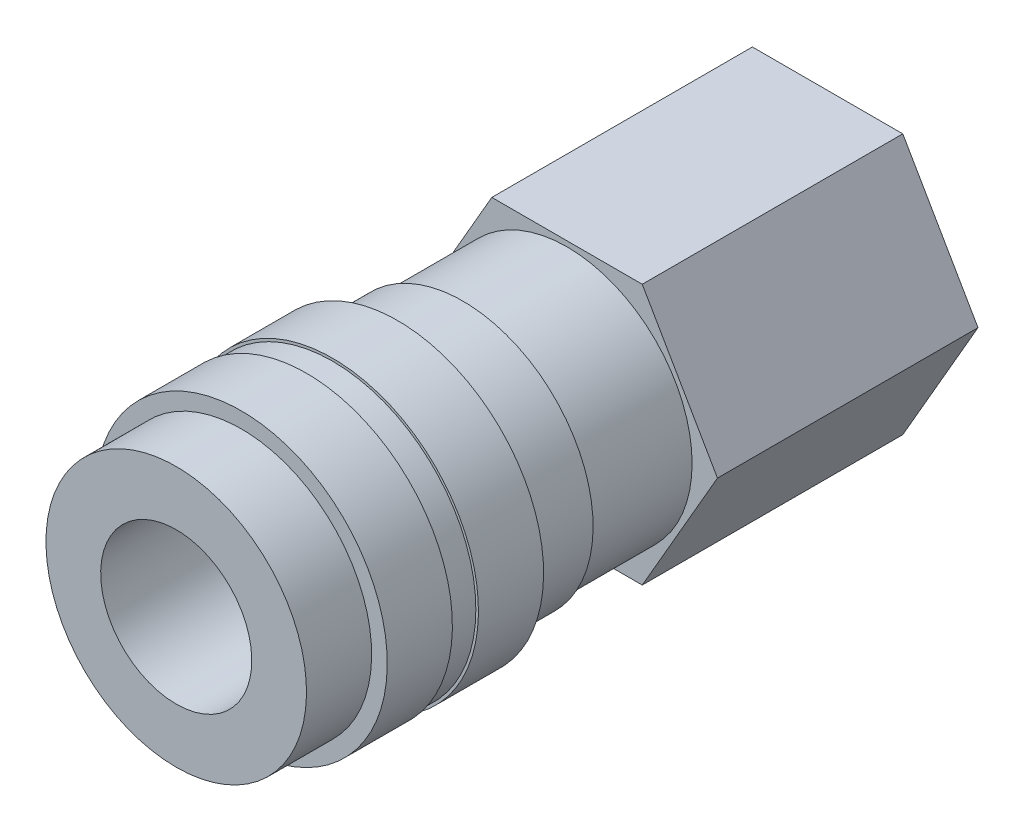
ISO-10303-21;
HEADER;
FILE_DESCRIPTION(('STEP AP214'),'2;1');
FILE_NAME('part.step','',(''),(''),'','','');
FILE_SCHEMA(('AUTOMOTIVE_DESIGN { 1 0 10303 214 1 1 1 1 }'));
ENDSEC;
DATA;
#1=APPLICATION_CONTEXT('core data for automotive mechanical design processes');
#2=APPLICATION_PROTOCOL_DEFINITION('international standard','automotive_design',2000,#1);
#3=PRODUCT_CONTEXT('',#1,'mechanical');
#4=PRODUCT('Part','Part','',(#3));
#5=PRODUCT_RELATED_PRODUCT_CATEGORY('part','',(#4));
#6=PRODUCT_DEFINITION_FORMATION('','',#4);
#7=PRODUCT_DEFINITION_CONTEXT('part definition',#1,'design');
#8=PRODUCT_DEFINITION('design','',#6,#7);
#9=PRODUCT_DEFINITION_SHAPE('','',#8);
#10=(LENGTH_UNIT() NAMED_UNIT(*) SI_UNIT(.MILLI.,.METRE.));
#11=(NAMED_UNIT(*) PLANE_ANGLE_UNIT() SI_UNIT($,.RADIAN.));
#12=(NAMED_UNIT(*) SI_UNIT($,.STERADIAN.) SOLID_ANGLE_UNIT());
#13=UNCERTAINTY_MEASURE_WITH_UNIT(LENGTH_MEASURE(1.E-05),#10,'distance_accuracy_value','');
#14=(GEOMETRIC_REPRESENTATION_CONTEXT(3) GLOBAL_UNCERTAINTY_ASSIGNED_CONTEXT((#13)) GLOBAL_UNIT_ASSIGNED_CONTEXT((#10,
#11,#12)) REPRESENTATION_CONTEXT('',''));
#15=CARTESIAN_POINT('',(0.,0.,0.));
#16=DIRECTION('',(0.,0.,1.));
#17=DIRECTION('',(1.,0.,0.));
#18=AXIS2_PLACEMENT_3D('',#15,#16,#17);
#19=CARTESIAN_POINT('',(0.,6.096,-19.05));
#20=DIRECTION('',(0.,0.,-1.));
#21=DIRECTION('',(0.,1.,0.));
#22=AXIS2_PLACEMENT_3D('',#19,#20,#21);
#23=PLANE('',#22);
#24=DIRECTION('',(0.5,0.866025403784439,0.));
#25=VECTOR('',#24,1.);
#26=CARTESIAN_POINT('',(-7.33234841870824,0.,-19.05));
#27=LINE('',#26,#25);
#28=CARTESIAN_POINT('',(-7.33234841870824,0.,-19.05));
#29=VERTEX_POINT('',#28);
#30=CARTESIAN_POINT('',(-3.66617420935412,6.35000000000001,-19.05));
#31=VERTEX_POINT('',#30);
#32=EDGE_CURVE('E100',#29,#31,#27,.T.);
#33=ORIENTED_EDGE('',*,*,#32,.F.);
#34=DIRECTION('',(-0.5,0.866025403784439,0.));
#35=VECTOR('',#34,1.);
#36=CARTESIAN_POINT('',(-3.66617420935412,-6.35,-19.05));
#37=LINE('',#36,#35);
#38=CARTESIAN_POINT('',(-3.66617420935412,-6.35,-19.05));
#39=VERTEX_POINT('',#38);
#40=EDGE_CURVE('E96',#39,#29,#37,.T.);
#41=ORIENTED_EDGE('',*,*,#40,.F.);
#42=DIRECTION('',(-1.,0.,0.));
#43=VECTOR('',#42,1.);
#44=CARTESIAN_POINT('',(3.66617420935413,-6.35,-19.05));
#45=LINE('',#44,#43);
#46=CARTESIAN_POINT('',(3.66617420935413,-6.35,-19.05));
#47=VERTEX_POINT('',#46);
#48=EDGE_CURVE('E107',#47,#39,#45,.T.);
#49=ORIENTED_EDGE('',*,*,#48,.F.);
#50=DIRECTION('',(-0.5,-0.866025403784439,0.));
#51=VECTOR('',#50,1.);
#52=CARTESIAN_POINT('',(7.33234841870825,0.,-19.05));
#53=LINE('',#52,#51);
#54=CARTESIAN_POINT('',(7.33234841870825,0.,-19.05));
#55=VERTEX_POINT('',#54);
#56=EDGE_CURVE('E47',#55,#47,#53,.T.);
#57=ORIENTED_EDGE('',*,*,#56,.F.);
#58=DIRECTION('',(0.5,-0.866025403784439,0.));
#59=VECTOR('',#58,1.);
#60=CARTESIAN_POINT('',(3.66617420935412,6.35000000000001,-19.05));
#61=LINE('',#60,#59);
#62=CARTESIAN_POINT('',(3.66617420935412,6.35000000000001,-19.05));
#63=VERTEX_POINT('',#62);
#64=EDGE_CURVE('E128',#63,#55,#61,.T.);
#65=ORIENTED_EDGE('',*,*,#64,.F.);
#66=DIRECTION('',(1.,0.,0.));
#67=VECTOR('',#66,1.);
#68=CARTESIAN_POINT('',(-3.66617420935412,6.35000000000001,-19.05));
#69=LINE('',#68,#67);
#70=EDGE_CURVE('E125',#31,#63,#69,.T.);
#71=ORIENTED_EDGE('',*,*,#70,.F.);
#72=EDGE_LOOP('',(#33,#41,#49,#57,#65,#71));
#73=FACE_BOUND('',#72,.T.);
#74=CARTESIAN_POINT('',(0.,0.,-19.05));
#75=DIRECTION('',(0.,0.,1.));
#76=DIRECTION('',(0.,-1.,0.));
#77=AXIS2_PLACEMENT_3D('',#74,#75,#76);
#78=CIRCLE('',#77,6.096);
#79=CARTESIAN_POINT('',(0.,-6.096,-19.05));
#80=VERTEX_POINT('',#79);
#81=EDGE_CURVE('E145',#80,#80,#78,.T.);
#82=ORIENTED_EDGE('',*,*,#81,.F.);
#83=EDGE_LOOP('',(#82));
#84=FACE_BOUND('',#83,.T.);
#85=ADVANCED_FACE('F33',(#73,#84),#23,.F.);
#86=CARTESIAN_POINT('',(0.,3.683,-12.7));
#87=DIRECTION('',(0.,0.,-1.));
#88=DIRECTION('',(0.,1.,0.));
#89=AXIS2_PLACEMENT_3D('',#86,#87,#88);
#90=PLANE('',#89);
#91=CARTESIAN_POINT('',(0.,0.,-12.7));
#92=DIRECTION('',(0.,0.,1.));
#93=DIRECTION('',(0.,-1.,0.));
#94=AXIS2_PLACEMENT_3D('',#91,#92,#93);
#95=CIRCLE('',#94,3.683);
#96=CARTESIAN_POINT('',(0.,-3.683,-12.7));
#97=VERTEX_POINT('',#96);
#98=EDGE_CURVE('E11',#97,#97,#95,.T.);
#99=ORIENTED_EDGE('',*,*,#98,.T.);
#100=EDGE_LOOP('',(#99));
#101=FACE_BOUND('',#100,.T.);
#102=ADVANCED_FACE('F259',(#101),#90,.F.);
#103=CARTESIAN_POINT('',(0.,0.,-12.7));
#104=DIRECTION('',(0.,0.,1.));
#105=DIRECTION('',(0.,-1.,0.));
#106=AXIS2_PLACEMENT_3D('',#103,#104,#105);
#107=CYLINDRICAL_SURFACE('',#106,3.683);
#108=ORIENTED_EDGE('',*,*,#98,.F.);
#109=EDGE_LOOP('',(#108));
#110=FACE_BOUND('',#109,.T.);
#111=CARTESIAN_POINT('',(0.,0.,0.));
#112=DIRECTION('',(0.,0.,1.));
#113=DIRECTION('',(0.,-1.,0.));
#114=AXIS2_PLACEMENT_3D('',#111,#112,#113);
#115=CIRCLE('',#114,3.683);
#116=CARTESIAN_POINT('',(0.,-3.683,0.));
#117=VERTEX_POINT('',#116);
#118=EDGE_CURVE('E40',#117,#117,#115,.T.);
#119=ORIENTED_EDGE('',*,*,#118,.T.);
#120=EDGE_LOOP('',(#119));
#121=FACE_BOUND('',#120,.T.);
#122=ADVANCED_FACE('F183',(#110,#121),#107,.F.);
#123=CARTESIAN_POINT('',(0.,3.683,0.));
#124=DIRECTION('',(0.,0.,-1.));
#125=DIRECTION('',(0.,1.,0.));
#126=AXIS2_PLACEMENT_3D('',#123,#124,#125);
#127=PLANE('',#126);
#128=ORIENTED_EDGE('',*,*,#118,.F.);
#129=EDGE_LOOP('',(#128));
#130=FACE_BOUND('',#129,.T.);
#131=CARTESIAN_POINT('',(0.,0.,0.));
#132=DIRECTION('',(0.,0.,1.));
#133=DIRECTION('',(0.,-1.,0.));
#134=AXIS2_PLACEMENT_3D('',#131,#132,#133);
#135=CIRCLE('',#134,6.35);
#136=CARTESIAN_POINT('',(0.,-6.35,0.));
#137=VERTEX_POINT('',#136);
#138=EDGE_CURVE('E178',#137,#137,#135,.T.);
#139=ORIENTED_EDGE('',*,*,#138,.T.);
#140=EDGE_LOOP('',(#139));
#141=FACE_BOUND('',#140,.T.);
#142=ADVANCED_FACE('F185',(#130,#141),#127,.F.);
#143=CARTESIAN_POINT('',(0.,0.,-12.7));
#144=DIRECTION('',(0.,0.,1.));
#145=DIRECTION('',(0.,-1.,0.));
#146=AXIS2_PLACEMENT_3D('',#143,#144,#145);
#147=CYLINDRICAL_SURFACE('',#146,6.35);
#148=ORIENTED_EDGE('',*,*,#138,.F.);
#149=EDGE_LOOP('',(#148));
#150=FACE_BOUND('',#149,.T.);
#151=CARTESIAN_POINT('',(0.,0.,-3.175));
#152=DIRECTION('',(0.,0.,1.));
#153=DIRECTION('',(0.,-1.,0.));
#154=AXIS2_PLACEMENT_3D('',#151,#152,#153);
#155=CIRCLE('',#154,6.35);
#156=CARTESIAN_POINT('',(0.,-6.35,-3.175));
#157=VERTEX_POINT('',#156);
#158=EDGE_CURVE('E175',#157,#157,#155,.T.);
#159=ORIENTED_EDGE('',*,*,#158,.T.);
#160=EDGE_LOOP('',(#159));
#161=FACE_BOUND('',#160,.T.);
#162=ADVANCED_FACE('F188',(#150,#161),#147,.T.);
#163=CARTESIAN_POINT('',(0.,6.35,-3.175));
#164=DIRECTION('',(0.,0.,-1.));
#165=DIRECTION('',(0.,1.,0.));
#166=AXIS2_PLACEMENT_3D('',#163,#164,#165);
#167=PLANE('',#166);
#168=ORIENTED_EDGE('',*,*,#158,.F.);
#169=EDGE_LOOP('',(#168));
#170=FACE_BOUND('',#169,.T.);
#171=CARTESIAN_POINT('',(0.,0.,-3.175));
#172=DIRECTION('',(0.,0.,1.));
#173=DIRECTION('',(0.,-1.,0.));
#174=AXIS2_PLACEMENT_3D('',#171,#172,#173);
#175=CIRCLE('',#174,7.112);
#176=CARTESIAN_POINT('',(0.,-7.112,-3.175));
#177=VERTEX_POINT('',#176);
#178=EDGE_CURVE('E172',#177,#177,#175,.T.);
#179=ORIENTED_EDGE('',*,*,#178,.T.);
#180=EDGE_LOOP('',(#179));
#181=FACE_BOUND('',#180,.T.);
#182=ADVANCED_FACE('F194',(#170,#181),#167,.F.);
#183=CARTESIAN_POINT('',(0.,0.,-12.7));
#184=DIRECTION('',(0.,0.,1.));
#185=DIRECTION('',(0.,-1.,0.));
#186=AXIS2_PLACEMENT_3D('',#183,#184,#185);
#187=CYLINDRICAL_SURFACE('',#186,7.112);
#188=ORIENTED_EDGE('',*,*,#178,.F.);
#189=EDGE_LOOP('',(#188));
#190=FACE_BOUND('',#189,.T.);
#191=CARTESIAN_POINT('',(0.,0.,-6.35));
#192=DIRECTION('',(0.,0.,1.));
#193=DIRECTION('',(0.,-1.,0.));
#194=AXIS2_PLACEMENT_3D('',#191,#192,#193);
#195=CIRCLE('',#194,7.112);
#196=CARTESIAN_POINT('',(0.,-7.112,-6.35));
#197=VERTEX_POINT('',#196);
#198=EDGE_CURVE('E169',#197,#197,#195,.T.);
#199=ORIENTED_EDGE('',*,*,#198,.T.);
#200=EDGE_LOOP('',(#199));
#201=FACE_BOUND('',#200,.T.);
#202=ADVANCED_FACE('F200',(#190,#201),#187,.T.);
#203=CARTESIAN_POINT('',(0.,7.112,-6.35));
#204=DIRECTION('',(0.,0.,1.));
#205=DIRECTION('',(0.,-1.,0.));
#206=AXIS2_PLACEMENT_3D('',#203,#204,#205);
#207=PLANE('',#206);
#208=ORIENTED_EDGE('',*,*,#198,.F.);
#209=EDGE_LOOP('',(#208));
#210=FACE_BOUND('',#209,.T.);
#211=CARTESIAN_POINT('',(0.,0.,-6.35));
#212=DIRECTION('',(0.,0.,1.));
#213=DIRECTION('',(0.,-1.,0.));
#214=AXIS2_PLACEMENT_3D('',#211,#212,#213);
#215=CIRCLE('',#214,6.985);
#216=CARTESIAN_POINT('',(0.,-6.985,-6.35));
#217=VERTEX_POINT('',#216);
#218=EDGE_CURVE('E166',#217,#217,#215,.T.);
#219=ORIENTED_EDGE('',*,*,#218,.T.);
#220=EDGE_LOOP('',(#219));
#221=FACE_BOUND('',#220,.T.);
#222=ADVANCED_FACE('F206',(#210,#221),#207,.F.);
#223=CARTESIAN_POINT('',(0.,0.,-12.7));
#224=DIRECTION('',(0.,0.,1.));
#225=DIRECTION('',(0.,-1.,0.));
#226=AXIS2_PLACEMENT_3D('',#223,#224,#225);
#227=CYLINDRICAL_SURFACE('',#226,6.985);
#228=ORIENTED_EDGE('',*,*,#218,.F.);
#229=EDGE_LOOP('',(#228));
#230=FACE_BOUND('',#229,.T.);
#231=CARTESIAN_POINT('',(0.,0.,-7.62));
#232=DIRECTION('',(0.,0.,1.));
#233=DIRECTION('',(0.,-1.,0.));
#234=AXIS2_PLACEMENT_3D('',#231,#232,#233);
#235=CIRCLE('',#234,6.985);
#236=CARTESIAN_POINT('',(0.,-6.985,-7.62));
#237=VERTEX_POINT('',#236);
#238=EDGE_CURVE('E163',#237,#237,#235,.T.);
#239=ORIENTED_EDGE('',*,*,#238,.T.);
#240=EDGE_LOOP('',(#239));
#241=FACE_BOUND('',#240,.T.);
#242=ADVANCED_FACE('F212',(#230,#241),#227,.T.);
#243=CARTESIAN_POINT('',(0.,6.985,-7.62));
#244=DIRECTION('',(0.,0.,-1.));
#245=DIRECTION('',(0.,1.,0.));
#246=AXIS2_PLACEMENT_3D('',#243,#244,#245);
#247=PLANE('',#246);
#248=ORIENTED_EDGE('',*,*,#238,.F.);
#249=EDGE_LOOP('',(#248));
#250=FACE_BOUND('',#249,.T.);
#251=CARTESIAN_POINT('',(0.,0.,-7.62));
#252=DIRECTION('',(0.,0.,1.));
#253=DIRECTION('',(0.,-1.,0.));
#254=AXIS2_PLACEMENT_3D('',#251,#252,#253);
#255=CIRCLE('',#254,7.112);
#256=CARTESIAN_POINT('',(0.,-7.112,-7.62));
#257=VERTEX_POINT('',#256);
#258=EDGE_CURVE('E160',#257,#257,#255,.T.);
#259=ORIENTED_EDGE('',*,*,#258,.T.);
#260=EDGE_LOOP('',(#259));
#261=FACE_BOUND('',#260,.T.);
#262=ADVANCED_FACE('F218',(#250,#261),#247,.F.);
#263=CARTESIAN_POINT('',(0.,0.,-12.7));
#264=DIRECTION('',(0.,0.,1.));
#265=DIRECTION('',(0.,-1.,0.));
#266=AXIS2_PLACEMENT_3D('',#263,#264,#265);
#267=CYLINDRICAL_SURFACE('',#266,7.112);
#268=ORIENTED_EDGE('',*,*,#258,.F.);
#269=EDGE_LOOP('',(#268));
#270=FACE_BOUND('',#269,.T.);
#271=CARTESIAN_POINT('',(0.,0.,-10.795));
#272=DIRECTION('',(0.,0.,1.));
#273=DIRECTION('',(0.,-1.,0.));
#274=AXIS2_PLACEMENT_3D('',#271,#272,#273);
#275=CIRCLE('',#274,7.112);
#276=CARTESIAN_POINT('',(0.,-7.112,-10.795));
#277=VERTEX_POINT('',#276);
#278=EDGE_CURVE('E157',#277,#277,#275,.T.);
#279=ORIENTED_EDGE('',*,*,#278,.T.);
#280=EDGE_LOOP('',(#279));
#281=FACE_BOUND('',#280,.T.);
#282=ADVANCED_FACE('F224',(#270,#281),#267,.T.);
#283=CARTESIAN_POINT('',(0.,7.112,-10.795));
#284=DIRECTION('',(0.,0.,1.));
#285=DIRECTION('',(0.,-1.,0.));
#286=AXIS2_PLACEMENT_3D('',#283,#284,#285);
#287=PLANE('',#286);
#288=ORIENTED_EDGE('',*,*,#278,.F.);
#289=EDGE_LOOP('',(#288));
#290=FACE_BOUND('',#289,.T.);
#291=CARTESIAN_POINT('',(0.,0.,-10.795));
#292=DIRECTION('',(0.,0.,1.));
#293=DIRECTION('',(0.,-1.,0.));
#294=AXIS2_PLACEMENT_3D('',#291,#292,#293);
#295=CIRCLE('',#294,6.35);
#296=CARTESIAN_POINT('',(0.,-6.35,-10.795));
#297=VERTEX_POINT('',#296);
#298=EDGE_CURVE('E154',#297,#297,#295,.T.);
#299=ORIENTED_EDGE('',*,*,#298,.T.);
#300=EDGE_LOOP('',(#299));
#301=FACE_BOUND('',#300,.T.);
#302=ADVANCED_FACE('F230',(#290,#301),#287,.F.);
#303=CARTESIAN_POINT('',(0.,0.,-12.7));
#304=DIRECTION('',(0.,0.,1.));
#305=DIRECTION('',(0.,-1.,0.));
#306=AXIS2_PLACEMENT_3D('',#303,#304,#305);
#307=CYLINDRICAL_SURFACE('',#306,6.35);
#308=ORIENTED_EDGE('',*,*,#298,.F.);
#309=EDGE_LOOP('',(#308));
#310=FACE_BOUND('',#309,.T.);
#311=CARTESIAN_POINT('',(0.,0.,-13.97));
#312=DIRECTION('',(0.,0.,1.));
#313=DIRECTION('',(0.,-1.,0.));
#314=AXIS2_PLACEMENT_3D('',#311,#312,#313);
#315=CIRCLE('',#314,6.35);
#316=CARTESIAN_POINT('',(0.,-6.35,-13.97));
#317=VERTEX_POINT('',#316);
#318=EDGE_CURVE('E151',#317,#317,#315,.T.);
#319=ORIENTED_EDGE('',*,*,#318,.T.);
#320=EDGE_LOOP('',(#319));
#321=FACE_BOUND('',#320,.T.);
#322=ADVANCED_FACE('F236',(#310,#321),#307,.T.);
#323=CARTESIAN_POINT('',(0.,6.35,-13.97));
#324=DIRECTION('',(0.,0.,1.));
#325=DIRECTION('',(0.,-1.,0.));
#326=AXIS2_PLACEMENT_3D('',#323,#324,#325);
#327=PLANE('',#326);
#328=ORIENTED_EDGE('',*,*,#318,.F.);
#329=EDGE_LOOP('',(#328));
#330=FACE_BOUND('',#329,.T.);
#331=CARTESIAN_POINT('',(0.,0.,-13.97));
#332=DIRECTION('',(0.,0.,1.));
#333=DIRECTION('',(0.,-1.,0.));
#334=AXIS2_PLACEMENT_3D('',#331,#332,#333);
#335=CIRCLE('',#334,6.096);
#336=CARTESIAN_POINT('',(0.,-6.096,-13.97));
#337=VERTEX_POINT('',#336);
#338=EDGE_CURVE('E148',#337,#337,#335,.T.);
#339=ORIENTED_EDGE('',*,*,#338,.T.);
#340=EDGE_LOOP('',(#339));
#341=FACE_BOUND('',#340,.T.);
#342=ADVANCED_FACE('F242',(#330,#341),#327,.F.);
#343=CARTESIAN_POINT('',(0.,0.,-12.7));
#344=DIRECTION('',(0.,0.,1.));
#345=DIRECTION('',(0.,-1.,0.));
#346=AXIS2_PLACEMENT_3D('',#343,#344,#345);
#347=CYLINDRICAL_SURFACE('',#346,6.096);
#348=ORIENTED_EDGE('',*,*,#338,.F.);
#349=EDGE_LOOP('',(#348));
#350=FACE_BOUND('',#349,.T.);
#351=ORIENTED_EDGE('',*,*,#81,.T.);
#352=EDGE_LOOP('',(#351));
#353=FACE_BOUND('',#352,.T.);
#354=ADVANCED_FACE('F248',(#350,#353),#347,.T.);
#355=CARTESIAN_POINT('',(-3.66617420935412,-6.35,-31.75));
#356=DIRECTION('',(0.866025403784439,0.5,0.));
#357=DIRECTION('',(-0.5,0.866025403784439,0.));
#358=AXIS2_PLACEMENT_3D('',#355,#356,#357);
#359=PLANE('',#358);
#360=ORIENTED_EDGE('',*,*,#40,.T.);
#361=DIRECTION('',(0.,0.,1.));
#362=VECTOR('',#361,1.);
#363=CARTESIAN_POINT('',(-7.33234841870824,0.,-31.75));
#364=LINE('',#363,#362);
#365=CARTESIAN_POINT('',(-7.33234841870824,0.,-31.75));
#366=VERTEX_POINT('',#365);
#367=EDGE_CURVE('E143',#366,#29,#364,.T.);
#368=ORIENTED_EDGE('',*,*,#367,.F.);
#369=DIRECTION('',(-0.5,0.866025403784439,0.));
#370=VECTOR('',#369,1.);
#371=CARTESIAN_POINT('',(-3.66617420935412,-6.35,-31.75));
#372=LINE('',#371,#370);
#373=CARTESIAN_POINT('',(-3.66617420935412,-6.35,-31.75));
#374=VERTEX_POINT('',#373);
#375=EDGE_CURVE('E55',#374,#366,#372,.T.);
#376=ORIENTED_EDGE('',*,*,#375,.F.);
#377=DIRECTION('',(0.,0.,1.));
#378=VECTOR('',#377,1.);
#379=CARTESIAN_POINT('',(-3.66617420935412,-6.35,-31.75));
#380=LINE('',#379,#378);
#381=EDGE_CURVE('E121',#374,#39,#380,.T.);
#382=ORIENTED_EDGE('',*,*,#381,.T.);
#383=EDGE_LOOP('',(#360,#368,#376,#382));
#384=FACE_BOUND('',#383,.T.);
#385=ADVANCED_FACE('F254',(#384),#359,.F.);
#386=CARTESIAN_POINT('',(-7.33234841870824,0.,-31.75));
#387=DIRECTION('',(0.866025403784439,-0.5,0.));
#388=DIRECTION('',(0.5,0.866025403784439,0.));
#389=AXIS2_PLACEMENT_3D('',#386,#387,#388);
#390=PLANE('',#389);
#391=ORIENTED_EDGE('',*,*,#32,.T.);
#392=DIRECTION('',(0.,0.,1.));
#393=VECTOR('',#392,1.);
#394=CARTESIAN_POINT('',(-3.66617420935412,6.35000000000001,-31.75));
#395=LINE('',#394,#393);
#396=CARTESIAN_POINT('',(-3.66617420935412,6.35000000000001,-31.75));
#397=VERTEX_POINT('',#396);
#398=EDGE_CURVE('E141',#397,#31,#395,.T.);
#399=ORIENTED_EDGE('',*,*,#398,.F.);
#400=DIRECTION('',(0.5,0.866025403784439,0.));
#401=VECTOR('',#400,1.);
#402=CARTESIAN_POINT('',(-7.33234841870824,0.,-31.75));
#403=LINE('',#402,#401);
#404=EDGE_CURVE('E106',#366,#397,#403,.T.);
#405=ORIENTED_EDGE('',*,*,#404,.F.);
#406=ORIENTED_EDGE('',*,*,#367,.T.);
#407=EDGE_LOOP('',(#391,#399,#405,#406));
#408=FACE_BOUND('',#407,.T.);
#409=ADVANCED_FACE('F272',(#408),#390,.F.);
#410=CARTESIAN_POINT('',(-3.66617420935412,6.35000000000001,-31.75));
#411=DIRECTION('',(0.,-1.,0.));
#412=DIRECTION('',(0.,0.,-1.));
#413=AXIS2_PLACEMENT_3D('',#410,#411,#412);
#414=PLANE('',#413);
#415=ORIENTED_EDGE('',*,*,#70,.T.);
#416=DIRECTION('',(0.,0.,1.));
#417=VECTOR('',#416,1.);
#418=CARTESIAN_POINT('',(3.66617420935412,6.35000000000001,-31.75));
#419=LINE('',#418,#417);
#420=CARTESIAN_POINT('',(3.66617420935412,6.35000000000001,-31.75));
#421=VERTEX_POINT('',#420);
#422=EDGE_CURVE('E139',#421,#63,#419,.T.);
#423=ORIENTED_EDGE('',*,*,#422,.F.);
#424=DIRECTION('',(1.,0.,0.));
#425=VECTOR('',#424,1.);
#426=CARTESIAN_POINT('',(-3.66617420935412,6.35000000000001,-31.75));
#427=LINE('',#426,#425);
#428=EDGE_CURVE('E110',#397,#421,#427,.T.);
#429=ORIENTED_EDGE('',*,*,#428,.F.);
#430=ORIENTED_EDGE('',*,*,#398,.T.);
#431=EDGE_LOOP('',(#415,#423,#429,#430));
#432=FACE_BOUND('',#431,.T.);
#433=ADVANCED_FACE('F283',(#432),#414,.F.);
#434=CARTESIAN_POINT('',(3.66617420935412,6.35000000000001,-31.75));
#435=DIRECTION('',(-0.866025403784439,-0.5,0.));
#436=DIRECTION('',(0.5,-0.866025403784439,0.));
#437=AXIS2_PLACEMENT_3D('',#434,#435,#436);
#438=PLANE('',#437);
#439=ORIENTED_EDGE('',*,*,#64,.T.);
#440=DIRECTION('',(0.,0.,1.));
#441=VECTOR('',#440,1.);
#442=CARTESIAN_POINT('',(7.33234841870825,0.,-31.75));
#443=LINE('',#442,#441);
#444=CARTESIAN_POINT('',(7.33234841870825,0.,-31.75));
#445=VERTEX_POINT('',#444);
#446=EDGE_CURVE('E137',#445,#55,#443,.T.);
#447=ORIENTED_EDGE('',*,*,#446,.F.);
#448=DIRECTION('',(0.5,-0.866025403784439,0.));
#449=VECTOR('',#448,1.);
#450=CARTESIAN_POINT('',(3.66617420935412,6.35000000000001,-31.75));
#451=LINE('',#450,#449);
#452=EDGE_CURVE('E113',#421,#445,#451,.T.);
#453=ORIENTED_EDGE('',*,*,#452,.F.);
#454=ORIENTED_EDGE('',*,*,#422,.T.);
#455=EDGE_LOOP('',(#439,#447,#453,#454));
#456=FACE_BOUND('',#455,.T.);
#457=ADVANCED_FACE('F279',(#456),#438,.F.);
#458=CARTESIAN_POINT('',(7.33234841870825,0.,-31.75));
#459=DIRECTION('',(-0.866025403784439,0.5,0.));
#460=DIRECTION('',(-0.5,-0.866025403784439,0.));
#461=AXIS2_PLACEMENT_3D('',#458,#459,#460);
#462=PLANE('',#461);
#463=ORIENTED_EDGE('',*,*,#56,.T.);
#464=DIRECTION('',(0.,0.,1.));
#465=VECTOR('',#464,1.);
#466=CARTESIAN_POINT('',(3.66617420935413,-6.35,-31.75));
#467=LINE('',#466,#465);
#468=CARTESIAN_POINT('',(3.66617420935413,-6.35,-31.75));
#469=VERTEX_POINT('',#468);
#470=EDGE_CURVE('E135',#469,#47,#467,.T.);
#471=ORIENTED_EDGE('',*,*,#470,.F.);
#472=DIRECTION('',(-0.5,-0.866025403784439,0.));
#473=VECTOR('',#472,1.);
#474=CARTESIAN_POINT('',(7.33234841870825,0.,-31.75));
#475=LINE('',#474,#473);
#476=EDGE_CURVE('E116',#445,#469,#475,.T.);
#477=ORIENTED_EDGE('',*,*,#476,.F.);
#478=ORIENTED_EDGE('',*,*,#446,.T.);
#479=EDGE_LOOP('',(#463,#471,#477,#478));
#480=FACE_BOUND('',#479,.T.);
#481=ADVANCED_FACE('F285',(#480),#462,.F.);
#482=CARTESIAN_POINT('',(3.66617420935413,-6.35,-31.75));
#483=DIRECTION('',(0.,1.,0.));
#484=DIRECTION('',(-1.,0.,0.));
#485=AXIS2_PLACEMENT_3D('',#482,#483,#484);
#486=PLANE('',#485);
#487=ORIENTED_EDGE('',*,*,#48,.T.);
#488=ORIENTED_EDGE('',*,*,#381,.F.);
#489=DIRECTION('',(-1.,0.,0.));
#490=VECTOR('',#489,1.);
#491=CARTESIAN_POINT('',(3.66617420935413,-6.35,-31.75));
#492=LINE('',#491,#490);
#493=EDGE_CURVE('E119',#469,#374,#492,.T.);
#494=ORIENTED_EDGE('',*,*,#493,.F.);
#495=ORIENTED_EDGE('',*,*,#470,.T.);
#496=EDGE_LOOP('',(#487,#488,#494,#495));
#497=FACE_BOUND('',#496,.T.);
#498=ADVANCED_FACE('F277',(#497),#486,.F.);
#499=CARTESIAN_POINT('',(0.,0.,-31.75));
#500=DIRECTION('',(0.,0.,1.));
#501=DIRECTION('',(0.,-1.,0.));
#502=AXIS2_PLACEMENT_3D('',#499,#500,#501);
#503=PLANE('',#502);
#504=CARTESIAN_POINT('',(0.,0.,-31.75));
#505=DIRECTION('',(0.,0.,-1.));
#506=DIRECTION('',(0.,1.,0.));
#507=AXIS2_PLACEMENT_3D('',#504,#505,#506);
#508=CIRCLE('',#507,4.21639999999999);
#509=CARTESIAN_POINT('',(0.,4.21639999999999,-31.75));
#510=VERTEX_POINT('',#509);
#511=EDGE_CURVE('E97',#510,#510,#508,.T.);
#512=ORIENTED_EDGE('',*,*,#511,.F.);
#513=EDGE_LOOP('',(#512));
#514=FACE_BOUND('',#513,.T.);
#515=ORIENTED_EDGE('',*,*,#493,.T.);
#516=ORIENTED_EDGE('',*,*,#375,.T.);
#517=ORIENTED_EDGE('',*,*,#404,.T.);
#518=ORIENTED_EDGE('',*,*,#428,.T.);
#519=ORIENTED_EDGE('',*,*,#452,.T.);
#520=ORIENTED_EDGE('',*,*,#476,.T.);
#521=EDGE_LOOP('',(#515,#516,#517,#518,#519,#520));
#522=FACE_BOUND('',#521,.T.);
#523=ADVANCED_FACE('F90',(#514,#522),#503,.F.);
#524=CARTESIAN_POINT('',(0.,0.,-25.4));
#525=DIRECTION('',(0.,0.,-1.));
#526=DIRECTION('',(0.,1.,0.));
#527=AXIS2_PLACEMENT_3D('',#524,#525,#526);
#528=CONICAL_SURFACE('',#527,4.21639999999999,1.02974425867665);
#529=CARTESIAN_POINT('',(0.,0.,-22.8665312859322));
#530=VERTEX_POINT('',#529);
#531=VERTEX_LOOP('',#530);
#532=FACE_BOUND('',#531,.T.);
#533=CARTESIAN_POINT('',(0.,0.,-25.4));
#534=DIRECTION('',(0.,0.,-1.));
#535=DIRECTION('',(0.,1.,0.));
#536=AXIS2_PLACEMENT_3D('',#533,#534,#535);
#537=CIRCLE('',#536,4.21639999999999);
#538=CARTESIAN_POINT('',(0.,4.21639999999999,-25.4));
#539=VERTEX_POINT('',#538);
#540=EDGE_CURVE('E94',#539,#539,#537,.T.);
#541=ORIENTED_EDGE('',*,*,#540,.T.);
#542=EDGE_LOOP('',(#541));
#543=FACE_BOUND('',#542,.T.);
#544=ADVANCED_FACE('F86',(#532,#543),#528,.F.);
#545=CARTESIAN_POINT('',(0.,0.,-31.75));
#546=DIRECTION('',(0.,0.,-1.));
#547=DIRECTION('',(0.,1.,0.));
#548=AXIS2_PLACEMENT_3D('',#545,#546,#547);
#549=CYLINDRICAL_SURFACE('',#548,4.21639999999999);
#550=ORIENTED_EDGE('',*,*,#540,.F.);
#551=EDGE_LOOP('',(#550));
#552=FACE_BOUND('',#551,.T.);
#553=ORIENTED_EDGE('',*,*,#511,.T.);
#554=EDGE_LOOP('',(#553));
#555=FACE_BOUND('',#554,.T.);
#556=ADVANCED_FACE('F89',(#552,#555),#549,.F.);
#557=CLOSED_SHELL('',(#85,#102,#122,#142,#162,#182,#202,#222,#242,#262,#282,#302,#322,#342,#354,
#385,#409,#433,#457,#481,#498,#523,#544,#556));
#558=MANIFOLD_SOLID_BREP('B2',#557);
#559=ADVANCED_BREP_SHAPE_REPRESENTATION('',(#18,#558),#14);
#560=SHAPE_DEFINITION_REPRESENTATION(#9,#559);
ENDSEC;
END-ISO-10303-21;
